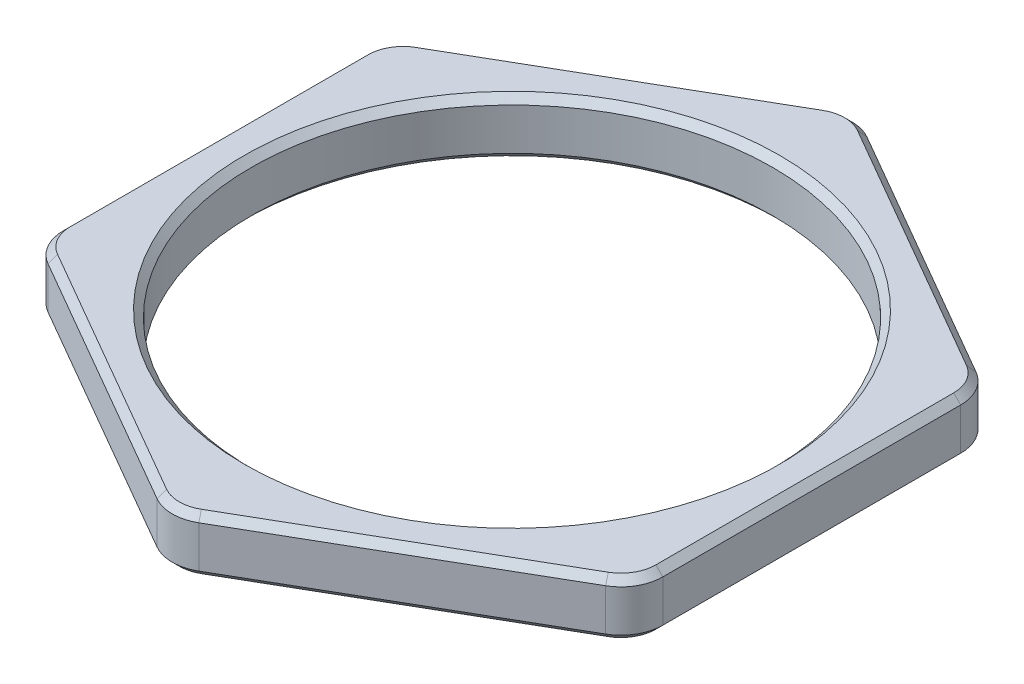
ISO-10303-21;
HEADER;
FILE_DESCRIPTION(('STEP AP214'),'2;1');
FILE_NAME('part.step','',(''),(''),'','','');
FILE_SCHEMA(('AUTOMOTIVE_DESIGN { 1 0 10303 214 1 1 1 1 }'));
ENDSEC;
DATA;
#1=APPLICATION_CONTEXT('core data for automotive mechanical design processes');
#2=APPLICATION_PROTOCOL_DEFINITION('international standard','automotive_design',2000,#1);
#3=PRODUCT_CONTEXT('',#1,'mechanical');
#4=PRODUCT('Part','Part','',(#3));
#5=PRODUCT_RELATED_PRODUCT_CATEGORY('part','',(#4));
#6=PRODUCT_DEFINITION_FORMATION('','',#4);
#7=PRODUCT_DEFINITION_CONTEXT('part definition',#1,'design');
#8=PRODUCT_DEFINITION('design','',#6,#7);
#9=PRODUCT_DEFINITION_SHAPE('','',#8);
#10=(LENGTH_UNIT() NAMED_UNIT(*) SI_UNIT(.MILLI.,.METRE.));
#11=(NAMED_UNIT(*) PLANE_ANGLE_UNIT() SI_UNIT($,.RADIAN.));
#12=(NAMED_UNIT(*) SI_UNIT($,.STERADIAN.) SOLID_ANGLE_UNIT());
#13=UNCERTAINTY_MEASURE_WITH_UNIT(LENGTH_MEASURE(1.E-05),#10,'distance_accuracy_value','');
#14=(GEOMETRIC_REPRESENTATION_CONTEXT(3) GLOBAL_UNCERTAINTY_ASSIGNED_CONTEXT((#13)) GLOBAL_UNIT_ASSIGNED_CONTEXT((#10,
#11,#12)) REPRESENTATION_CONTEXT('',''));
#15=CARTESIAN_POINT('',(0.,0.,0.));
#16=DIRECTION('',(0.,0.,1.));
#17=DIRECTION('',(1.,0.,0.));
#18=AXIS2_PLACEMENT_3D('',#15,#16,#17);
#19=CARTESIAN_POINT('',(0.,4.,-21.3619599600162));
#20=DIRECTION('',(0.,-1.,0.));
#21=DIRECTION('',(0.,0.,-1.));
#22=AXIS2_PLACEMENT_3D('',#19,#20,#21);
#23=PLANE('',#22);
#24=CARTESIAN_POINT('',(0.,4.,0.));
#25=DIRECTION('',(0.,-1.,0.));
#26=DIRECTION('',(0.,0.,-1.));
#27=AXIS2_PLACEMENT_3D('',#24,#25,#26);
#28=CIRCLE('',#27,19.1949509943483);
#29=CARTESIAN_POINT('',(0.,4.,-19.1949509943483));
#30=VERTEX_POINT('',#29);
#31=EDGE_CURVE('E11',#30,#30,#28,.T.);
#32=ORIENTED_EDGE('',*,*,#31,.T.);
#33=EDGE_LOOP('',(#32));
#34=FACE_BOUND('',#33,.T.);
#35=CARTESIAN_POINT('',(18.5,4.,-10.6809799800081));
#36=DIRECTION('',(0.,-1.,0.));
#37=DIRECTION('',(0.,0.,-1.));
#38=AXIS2_PLACEMENT_3D('',#35,#36,#37);
#39=CIRCLE('',#38,2.50000000000003);
#40=CARTESIAN_POINT('',(21.,4.,-10.6809799800081));
#41=VERTEX_POINT('',#40);
#42=CARTESIAN_POINT('',(19.75,4.,-12.8460434894692));
#43=VERTEX_POINT('',#42);
#44=EDGE_CURVE('E54',#41,#43,#39,.F.);
#45=ORIENTED_EDGE('',*,*,#44,.T.);
#46=DIRECTION('',(-0.866025403784438,0.,-0.5));
#47=VECTOR('',#46,1.);
#48=CARTESIAN_POINT('',(1.25000000000002,4.,-23.5270234694773));
#49=LINE('',#48,#47);
#50=CARTESIAN_POINT('',(1.25000000000002,4.,-23.5270234694773));
#51=VERTEX_POINT('',#50);
#52=EDGE_CURVE('E46',#43,#51,#49,.T.);
#53=ORIENTED_EDGE('',*,*,#52,.T.);
#54=CARTESIAN_POINT('',(0.,4.,-21.3619599600162));
#55=DIRECTION('',(0.,-1.,0.));
#56=DIRECTION('',(0.,0.,-1.));
#57=AXIS2_PLACEMENT_3D('',#54,#55,#56);
#58=CIRCLE('',#57,2.50000000000003);
#59=CARTESIAN_POINT('',(-1.25000000000001,4.,-23.5270234694773));
#60=VERTEX_POINT('',#59);
#61=EDGE_CURVE('E289',#51,#60,#58,.F.);
#62=ORIENTED_EDGE('',*,*,#61,.T.);
#63=DIRECTION('',(-0.866025403784439,0.,0.5));
#64=VECTOR('',#63,1.);
#65=CARTESIAN_POINT('',(-1.25000000000001,4.,-23.5270234694773));
#66=LINE('',#65,#64);
#67=CARTESIAN_POINT('',(-19.75,4.,-12.8460434894692));
#68=VERTEX_POINT('',#67);
#69=EDGE_CURVE('E291',#60,#68,#66,.T.);
#70=ORIENTED_EDGE('',*,*,#69,.T.);
#71=CARTESIAN_POINT('',(-18.5,4.,-10.6809799800081));
#72=DIRECTION('',(0.,-1.,0.));
#73=DIRECTION('',(0.,0.,-1.));
#74=AXIS2_PLACEMENT_3D('',#71,#72,#73);
#75=CIRCLE('',#74,2.50000000000003);
#76=CARTESIAN_POINT('',(-21.,4.,-10.6809799800081));
#77=VERTEX_POINT('',#76);
#78=EDGE_CURVE('E293',#68,#77,#75,.F.);
#79=ORIENTED_EDGE('',*,*,#78,.T.);
#80=DIRECTION('',(0.,0.,1.));
#81=VECTOR('',#80,1.);
#82=CARTESIAN_POINT('',(-21.,4.,-21.3619599600162));
#83=LINE('',#82,#81);
#84=CARTESIAN_POINT('',(-21.,4.,10.6809799800081));
#85=VERTEX_POINT('',#84);
#86=EDGE_CURVE('E295',#77,#85,#83,.T.);
#87=ORIENTED_EDGE('',*,*,#86,.T.);
#88=CARTESIAN_POINT('',(-18.5,4.,10.6809799800081));
#89=DIRECTION('',(0.,-1.,0.));
#90=DIRECTION('',(0.,0.,-1.));
#91=AXIS2_PLACEMENT_3D('',#88,#89,#90);
#92=CIRCLE('',#91,2.50000000000003);
#93=CARTESIAN_POINT('',(-19.75,4.,12.8460434894692));
#94=VERTEX_POINT('',#93);
#95=EDGE_CURVE('E297',#85,#94,#92,.F.);
#96=ORIENTED_EDGE('',*,*,#95,.T.);
#97=DIRECTION('',(0.866025403784439,0.,0.5));
#98=VECTOR('',#97,1.);
#99=CARTESIAN_POINT('',(-19.75,4.,12.8460434894692));
#100=LINE('',#99,#98);
#101=CARTESIAN_POINT('',(-1.25,4.,23.5270234694773));
#102=VERTEX_POINT('',#101);
#103=EDGE_CURVE('E299',#94,#102,#100,.T.);
#104=ORIENTED_EDGE('',*,*,#103,.T.);
#105=CARTESIAN_POINT('',(0.,4.,21.3619599600162));
#106=DIRECTION('',(0.,-1.,0.));
#107=DIRECTION('',(0.,0.,-1.));
#108=AXIS2_PLACEMENT_3D('',#105,#106,#107);
#109=CIRCLE('',#108,2.50000000000003);
#110=CARTESIAN_POINT('',(1.25000000000002,4.,23.5270234694773));
#111=VERTEX_POINT('',#110);
#112=EDGE_CURVE('E301',#102,#111,#109,.F.);
#113=ORIENTED_EDGE('',*,*,#112,.T.);
#114=DIRECTION('',(0.866025403784439,0.,-0.5));
#115=VECTOR('',#114,1.);
#116=CARTESIAN_POINT('',(19.75,4.,12.8460434894692));
#117=LINE('',#116,#115);
#118=CARTESIAN_POINT('',(19.75,4.,12.8460434894692));
#119=VERTEX_POINT('',#118);
#120=EDGE_CURVE('E303',#111,#119,#117,.T.);
#121=ORIENTED_EDGE('',*,*,#120,.T.);
#122=CARTESIAN_POINT('',(18.5,4.,10.6809799800081));
#123=DIRECTION('',(0.,-1.,0.));
#124=DIRECTION('',(0.,0.,-1.));
#125=AXIS2_PLACEMENT_3D('',#122,#123,#124);
#126=CIRCLE('',#125,2.50000000000003);
#127=CARTESIAN_POINT('',(21.,4.,10.6809799800081));
#128=VERTEX_POINT('',#127);
#129=EDGE_CURVE('E305',#119,#128,#126,.F.);
#130=ORIENTED_EDGE('',*,*,#129,.T.);
#131=DIRECTION('',(0.,0.,-1.));
#132=VECTOR('',#131,1.);
#133=CARTESIAN_POINT('',(21.,4.,-21.3619599600162));
#134=LINE('',#133,#132);
#135=EDGE_CURVE('E59',#128,#41,#134,.T.);
#136=ORIENTED_EDGE('',*,*,#135,.T.);
#137=EDGE_LOOP('',(#45,#53,#62,#70,#79,#87,#96,#104,#113,#121,#130,#136));
#138=FACE_BOUND('',#137,.T.);
#139=ADVANCED_FACE('F37',(#34,#138),#23,.F.);
#140=CARTESIAN_POINT('',(0.,0.,-21.3619599600162));
#141=DIRECTION('',(0.,-1.,0.));
#142=DIRECTION('',(0.,0.,-1.));
#143=AXIS2_PLACEMENT_3D('',#140,#141,#142);
#144=PLANE('',#143);
#145=CARTESIAN_POINT('',(0.,0.,0.));
#146=DIRECTION('',(0.,-1.,0.));
#147=DIRECTION('',(0.,0.,-1.));
#148=AXIS2_PLACEMENT_3D('',#145,#146,#147);
#149=CIRCLE('',#148,19.1949509943483);
#150=CARTESIAN_POINT('',(0.,0.,-19.1949509943483));
#151=VERTEX_POINT('',#150);
#152=EDGE_CURVE('E227',#151,#151,#149,.F.);
#153=ORIENTED_EDGE('',*,*,#152,.T.);
#154=EDGE_LOOP('',(#153));
#155=FACE_BOUND('',#154,.T.);
#156=CARTESIAN_POINT('',(-18.5,0.,-10.6809799800081));
#157=DIRECTION('',(0.,-1.,0.));
#158=DIRECTION('',(0.,0.,-1.));
#159=AXIS2_PLACEMENT_3D('',#156,#157,#158);
#160=CIRCLE('',#159,2.5);
#161=CARTESIAN_POINT('',(-21.,0.,-10.6809799800081));
#162=VERTEX_POINT('',#161);
#163=CARTESIAN_POINT('',(-19.75,0.,-12.8460434894692));
#164=VERTEX_POINT('',#163);
#165=EDGE_CURVE('E226',#162,#164,#160,.T.);
#166=ORIENTED_EDGE('',*,*,#165,.T.);
#167=DIRECTION('',(0.866025403784439,0.,-0.5));
#168=VECTOR('',#167,1.);
#169=CARTESIAN_POINT('',(-1.25,0.,-23.5270234694773));
#170=LINE('',#169,#168);
#171=CARTESIAN_POINT('',(-1.25,0.,-23.5270234694773));
#172=VERTEX_POINT('',#171);
#173=EDGE_CURVE('E205',#164,#172,#170,.T.);
#174=ORIENTED_EDGE('',*,*,#173,.T.);
#175=CARTESIAN_POINT('',(0.,0.,-21.3619599600162));
#176=DIRECTION('',(0.,-1.,0.));
#177=DIRECTION('',(0.,0.,-1.));
#178=AXIS2_PLACEMENT_3D('',#175,#176,#177);
#179=CIRCLE('',#178,2.5);
#180=CARTESIAN_POINT('',(1.25000000000001,0.,-23.5270234694773));
#181=VERTEX_POINT('',#180);
#182=EDGE_CURVE('E215',#172,#181,#179,.T.);
#183=ORIENTED_EDGE('',*,*,#182,.T.);
#184=DIRECTION('',(0.866025403784438,0.,0.5));
#185=VECTOR('',#184,1.);
#186=CARTESIAN_POINT('',(19.75,0.,-12.8460434894692));
#187=LINE('',#186,#185);
#188=CARTESIAN_POINT('',(19.75,0.,-12.8460434894692));
#189=VERTEX_POINT('',#188);
#190=EDGE_CURVE('E221',#181,#189,#187,.T.);
#191=ORIENTED_EDGE('',*,*,#190,.T.);
#192=CARTESIAN_POINT('',(18.5,0.,-10.6809799800081));
#193=DIRECTION('',(0.,-1.,0.));
#194=DIRECTION('',(0.,0.,-1.));
#195=AXIS2_PLACEMENT_3D('',#192,#193,#194);
#196=CIRCLE('',#195,2.5);
#197=CARTESIAN_POINT('',(21.,0.,-10.6809799800081));
#198=VERTEX_POINT('',#197);
#199=EDGE_CURVE('E412',#189,#198,#196,.T.);
#200=ORIENTED_EDGE('',*,*,#199,.T.);
#201=DIRECTION('',(0.,0.,1.));
#202=VECTOR('',#201,1.);
#203=CARTESIAN_POINT('',(21.,0.,10.6809799800081));
#204=LINE('',#203,#202);
#205=CARTESIAN_POINT('',(21.,0.,10.6809799800081));
#206=VERTEX_POINT('',#205);
#207=EDGE_CURVE('E414',#198,#206,#204,.T.);
#208=ORIENTED_EDGE('',*,*,#207,.T.);
#209=CARTESIAN_POINT('',(18.5,0.,10.6809799800081));
#210=DIRECTION('',(0.,-1.,0.));
#211=DIRECTION('',(0.,0.,-1.));
#212=AXIS2_PLACEMENT_3D('',#209,#210,#211);
#213=CIRCLE('',#212,2.5);
#214=CARTESIAN_POINT('',(19.75,0.,12.8460434894692));
#215=VERTEX_POINT('',#214);
#216=EDGE_CURVE('E416',#206,#215,#213,.T.);
#217=ORIENTED_EDGE('',*,*,#216,.T.);
#218=DIRECTION('',(-0.866025403784439,0.,0.5));
#219=VECTOR('',#218,1.);
#220=CARTESIAN_POINT('',(1.25000000000001,0.,23.5270234694772));
#221=LINE('',#220,#219);
#222=CARTESIAN_POINT('',(1.25000000000001,0.,23.5270234694772));
#223=VERTEX_POINT('',#222);
#224=EDGE_CURVE('E418',#215,#223,#221,.T.);
#225=ORIENTED_EDGE('',*,*,#224,.T.);
#226=CARTESIAN_POINT('',(0.,0.,21.3619599600162));
#227=DIRECTION('',(0.,-1.,0.));
#228=DIRECTION('',(0.,0.,-1.));
#229=AXIS2_PLACEMENT_3D('',#226,#227,#228);
#230=CIRCLE('',#229,2.5);
#231=CARTESIAN_POINT('',(-1.24999999999999,0.,23.5270234694772));
#232=VERTEX_POINT('',#231);
#233=EDGE_CURVE('E420',#223,#232,#230,.T.);
#234=ORIENTED_EDGE('',*,*,#233,.T.);
#235=DIRECTION('',(-0.866025403784439,0.,-0.5));
#236=VECTOR('',#235,1.);
#237=CARTESIAN_POINT('',(-19.75,0.,12.8460434894692));
#238=LINE('',#237,#236);
#239=CARTESIAN_POINT('',(-19.75,0.,12.8460434894692));
#240=VERTEX_POINT('',#239);
#241=EDGE_CURVE('E422',#232,#240,#238,.T.);
#242=ORIENTED_EDGE('',*,*,#241,.T.);
#243=CARTESIAN_POINT('',(-18.5,0.,10.6809799800081));
#244=DIRECTION('',(0.,-1.,0.));
#245=DIRECTION('',(0.,0.,-1.));
#246=AXIS2_PLACEMENT_3D('',#243,#244,#245);
#247=CIRCLE('',#246,2.5);
#248=CARTESIAN_POINT('',(-21.,0.,10.6809799800081));
#249=VERTEX_POINT('',#248);
#250=EDGE_CURVE('E424',#240,#249,#247,.T.);
#251=ORIENTED_EDGE('',*,*,#250,.T.);
#252=DIRECTION('',(0.,0.,-1.));
#253=VECTOR('',#252,1.);
#254=CARTESIAN_POINT('',(-21.,0.,-10.6809799800081));
#255=LINE('',#254,#253);
#256=EDGE_CURVE('E232',#249,#162,#255,.T.);
#257=ORIENTED_EDGE('',*,*,#256,.T.);
#258=EDGE_LOOP('',(#166,#174,#183,#191,#200,#208,#217,#225,#234,#242,#251,#257));
#259=FACE_BOUND('',#258,.T.);
#260=ADVANCED_FACE('F224',(#155,#259),#144,.T.);
#261=CARTESIAN_POINT('',(0.,4.,-21.3619599600162));
#262=DIRECTION('',(0.,-1.,0.));
#263=DIRECTION('',(0.,0.,-1.));
#264=AXIS2_PLACEMENT_3D('',#261,#262,#263);
#265=CYLINDRICAL_SURFACE('',#264,3.);
#266=DIRECTION('',(0.,-1.,0.));
#267=VECTOR('',#266,1.);
#268=CARTESIAN_POINT('',(1.50000000000001,4.,-23.9600361713695));
#269=LINE('',#268,#267);
#270=CARTESIAN_POINT('',(1.50000000000001,3.50000000000002,-23.9600361713695));
#271=VERTEX_POINT('',#270);
#272=CARTESIAN_POINT('',(1.50000000000001,0.499999999999998,-23.9600361713695));
#273=VERTEX_POINT('',#272);
#274=EDGE_CURVE('E338',#271,#273,#269,.T.);
#275=ORIENTED_EDGE('',*,*,#274,.T.);
#276=CARTESIAN_POINT('',(0.,0.499999999999998,-21.3619599600162));
#277=DIRECTION('',(0.,-1.,0.));
#278=DIRECTION('',(0.,0.,-1.));
#279=AXIS2_PLACEMENT_3D('',#276,#277,#278);
#280=CIRCLE('',#279,3.);
#281=CARTESIAN_POINT('',(-1.5,0.499999999999998,-23.9600361713695));
#282=VERTEX_POINT('',#281);
#283=EDGE_CURVE('E287',#273,#282,#280,.F.);
#284=ORIENTED_EDGE('',*,*,#283,.T.);
#285=DIRECTION('',(0.,-1.,0.));
#286=VECTOR('',#285,1.);
#287=CARTESIAN_POINT('',(-1.5,4.,-23.9600361713695));
#288=LINE('',#287,#286);
#289=CARTESIAN_POINT('',(-1.5,3.50000000000002,-23.9600361713695));
#290=VERTEX_POINT('',#289);
#291=EDGE_CURVE('E222',#290,#282,#288,.T.);
#292=ORIENTED_EDGE('',*,*,#291,.F.);
#293=CARTESIAN_POINT('',(0.,3.50000000000002,-21.3619599600162));
#294=DIRECTION('',(0.,-1.,0.));
#295=DIRECTION('',(0.,0.,-1.));
#296=AXIS2_PLACEMENT_3D('',#293,#294,#295);
#297=CIRCLE('',#296,3.);
#298=EDGE_CURVE('E285',#290,#271,#297,.T.);
#299=ORIENTED_EDGE('',*,*,#298,.T.);
#300=EDGE_LOOP('',(#275,#284,#292,#299));
#301=FACE_BOUND('',#300,.T.);
#302=ADVANCED_FACE('F456',(#301),#265,.T.);
#303=CARTESIAN_POINT('',(-1.5,4.,-23.9600361713695));
#304=DIRECTION('',(0.5,0.,0.866025403784439));
#305=DIRECTION('',(0.866025403784439,0.,-0.5));
#306=AXIS2_PLACEMENT_3D('',#303,#304,#305);
#307=PLANE('',#306);
#308=ORIENTED_EDGE('',*,*,#291,.T.);
#309=DIRECTION('',(-0.866025403784439,0.,0.5));
#310=VECTOR('',#309,1.);
#311=CARTESIAN_POINT('',(-20.,0.5,-13.2790561913614));
#312=LINE('',#311,#310);
#313=CARTESIAN_POINT('',(-20.,0.499999999999998,-13.2790561913614));
#314=VERTEX_POINT('',#313);
#315=EDGE_CURVE('E208',#282,#314,#312,.T.);
#316=ORIENTED_EDGE('',*,*,#315,.T.);
#317=DIRECTION('',(0.,-1.,0.));
#318=VECTOR('',#317,1.);
#319=CARTESIAN_POINT('',(-20.,4.,-13.2790561913614));
#320=LINE('',#319,#318);
#321=CARTESIAN_POINT('',(-20.,3.50000000000002,-13.2790561913614));
#322=VERTEX_POINT('',#321);
#323=EDGE_CURVE('E406',#322,#314,#320,.T.);
#324=ORIENTED_EDGE('',*,*,#323,.F.);
#325=DIRECTION('',(0.866025403784439,0.,-0.5));
#326=VECTOR('',#325,1.);
#327=CARTESIAN_POINT('',(-1.5,3.50000000000002,-23.9600361713695));
#328=LINE('',#327,#326);
#329=EDGE_CURVE('E241',#322,#290,#328,.T.);
#330=ORIENTED_EDGE('',*,*,#329,.T.);
#331=EDGE_LOOP('',(#308,#316,#324,#330));
#332=FACE_BOUND('',#331,.T.);
#333=ADVANCED_FACE('F439',(#332),#307,.F.);
#334=CARTESIAN_POINT('',(-18.5,4.,-10.6809799800081));
#335=DIRECTION('',(0.,-1.,0.));
#336=DIRECTION('',(0.,0.,-1.));
#337=AXIS2_PLACEMENT_3D('',#334,#335,#336);
#338=CYLINDRICAL_SURFACE('',#337,3.00000000000001);
#339=ORIENTED_EDGE('',*,*,#323,.T.);
#340=CARTESIAN_POINT('',(-18.5,0.499999999999998,-10.6809799800081));
#341=DIRECTION('',(0.,-1.,0.));
#342=DIRECTION('',(0.,0.,-1.));
#343=AXIS2_PLACEMENT_3D('',#340,#341,#342);
#344=CIRCLE('',#343,3.00000000000001);
#345=CARTESIAN_POINT('',(-21.5,0.499999999999998,-10.6809799800081));
#346=VERTEX_POINT('',#345);
#347=EDGE_CURVE('E246',#314,#346,#344,.F.);
#348=ORIENTED_EDGE('',*,*,#347,.T.);
#349=DIRECTION('',(0.,-1.,0.));
#350=VECTOR('',#349,1.);
#351=CARTESIAN_POINT('',(-21.5,4.,-10.6809799800081));
#352=LINE('',#351,#350);
#353=CARTESIAN_POINT('',(-21.5,3.50000000000002,-10.6809799800081));
#354=VERTEX_POINT('',#353);
#355=EDGE_CURVE('E398',#354,#346,#352,.T.);
#356=ORIENTED_EDGE('',*,*,#355,.F.);
#357=CARTESIAN_POINT('',(-18.5,3.50000000000002,-10.6809799800081));
#358=DIRECTION('',(0.,-1.,0.));
#359=DIRECTION('',(0.,0.,-1.));
#360=AXIS2_PLACEMENT_3D('',#357,#358,#359);
#361=CIRCLE('',#360,3.00000000000001);
#362=EDGE_CURVE('E244',#354,#322,#361,.T.);
#363=ORIENTED_EDGE('',*,*,#362,.T.);
#364=EDGE_LOOP('',(#339,#348,#356,#363));
#365=FACE_BOUND('',#364,.T.);
#366=ADVANCED_FACE('F442',(#365),#338,.T.);
#367=CARTESIAN_POINT('',(-21.5,4.,-10.6809799800081));
#368=DIRECTION('',(1.,0.,0.));
#369=DIRECTION('',(0.,0.,-1.));
#370=AXIS2_PLACEMENT_3D('',#367,#368,#369);
#371=PLANE('',#370);
#372=ORIENTED_EDGE('',*,*,#355,.T.);
#373=DIRECTION('',(0.,0.,1.));
#374=VECTOR('',#373,1.);
#375=CARTESIAN_POINT('',(-21.5,0.499999999999998,10.6809799800081));
#376=LINE('',#375,#374);
#377=CARTESIAN_POINT('',(-21.5,0.499999999999998,10.6809799800081));
#378=VERTEX_POINT('',#377);
#379=EDGE_CURVE('E250',#346,#378,#376,.T.);
#380=ORIENTED_EDGE('',*,*,#379,.T.);
#381=DIRECTION('',(0.,-1.,0.));
#382=VECTOR('',#381,1.);
#383=CARTESIAN_POINT('',(-21.5,4.,10.6809799800081));
#384=LINE('',#383,#382);
#385=CARTESIAN_POINT('',(-21.5,3.50000000000002,10.6809799800081));
#386=VERTEX_POINT('',#385);
#387=EDGE_CURVE('E396',#386,#378,#384,.T.);
#388=ORIENTED_EDGE('',*,*,#387,.F.);
#389=DIRECTION('',(0.,0.,-1.));
#390=VECTOR('',#389,1.);
#391=CARTESIAN_POINT('',(-21.5,3.50000000000002,-10.6809799800081));
#392=LINE('',#391,#390);
#393=EDGE_CURVE('E248',#386,#354,#392,.T.);
#394=ORIENTED_EDGE('',*,*,#393,.T.);
#395=EDGE_LOOP('',(#372,#380,#388,#394));
#396=FACE_BOUND('',#395,.T.);
#397=ADVANCED_FACE('F543',(#396),#371,.F.);
#398=CARTESIAN_POINT('',(-18.5,4.,10.6809799800081));
#399=DIRECTION('',(0.,-1.,0.));
#400=DIRECTION('',(0.,0.,-1.));
#401=AXIS2_PLACEMENT_3D('',#398,#399,#400);
#402=CYLINDRICAL_SURFACE('',#401,3.);
#403=ORIENTED_EDGE('',*,*,#387,.T.);
#404=CARTESIAN_POINT('',(-18.5,0.499999999999998,10.6809799800081));
#405=DIRECTION('',(0.,-1.,0.));
#406=DIRECTION('',(0.,0.,-1.));
#407=AXIS2_PLACEMENT_3D('',#404,#405,#406);
#408=CIRCLE('',#407,3.);
#409=CARTESIAN_POINT('',(-20.,0.499999999999999,13.2790561913614));
#410=VERTEX_POINT('',#409);
#411=EDGE_CURVE('E254',#378,#410,#408,.F.);
#412=ORIENTED_EDGE('',*,*,#411,.T.);
#413=DIRECTION('',(0.,-1.,0.));
#414=VECTOR('',#413,1.);
#415=CARTESIAN_POINT('',(-20.,4.,13.2790561913614));
#416=LINE('',#415,#414);
#417=CARTESIAN_POINT('',(-20.,3.50000000000002,13.2790561913614));
#418=VERTEX_POINT('',#417);
#419=EDGE_CURVE('E387',#418,#410,#416,.T.);
#420=ORIENTED_EDGE('',*,*,#419,.F.);
#421=CARTESIAN_POINT('',(-18.5,3.50000000000002,10.6809799800081));
#422=DIRECTION('',(0.,-1.,0.));
#423=DIRECTION('',(0.,0.,-1.));
#424=AXIS2_PLACEMENT_3D('',#421,#422,#423);
#425=CIRCLE('',#424,3.);
#426=EDGE_CURVE('E252',#418,#386,#425,.T.);
#427=ORIENTED_EDGE('',*,*,#426,.T.);
#428=EDGE_LOOP('',(#403,#412,#420,#427));
#429=FACE_BOUND('',#428,.T.);
#430=ADVANCED_FACE('F393',(#429),#402,.T.);
#431=CARTESIAN_POINT('',(-20.,4.,13.2790561913614));
#432=DIRECTION('',(0.5,0.,-0.866025403784439));
#433=DIRECTION('',(-0.866025403784439,0.,-0.5));
#434=AXIS2_PLACEMENT_3D('',#431,#432,#433);
#435=PLANE('',#434);
#436=ORIENTED_EDGE('',*,*,#419,.T.);
#437=DIRECTION('',(0.866025403784439,0.,0.5));
#438=VECTOR('',#437,1.);
#439=CARTESIAN_POINT('',(-1.49999999999999,0.499999999999999,23.9600361713695));
#440=LINE('',#439,#438);
#441=CARTESIAN_POINT('',(-1.49999999999999,0.499999999999998,23.9600361713695));
#442=VERTEX_POINT('',#441);
#443=EDGE_CURVE('E258',#410,#442,#440,.T.);
#444=ORIENTED_EDGE('',*,*,#443,.T.);
#445=DIRECTION('',(0.,-1.,0.));
#446=VECTOR('',#445,1.);
#447=CARTESIAN_POINT('',(-1.49999999999999,4.,23.9600361713695));
#448=LINE('',#447,#446);
#449=CARTESIAN_POINT('',(-1.49999999999999,3.50000000000002,23.9600361713695));
#450=VERTEX_POINT('',#449);
#451=EDGE_CURVE('E390',#450,#442,#448,.T.);
#452=ORIENTED_EDGE('',*,*,#451,.F.);
#453=DIRECTION('',(-0.866025403784439,0.,-0.5));
#454=VECTOR('',#453,1.);
#455=CARTESIAN_POINT('',(-20.,3.50000000000002,13.2790561913614));
#456=LINE('',#455,#454);
#457=EDGE_CURVE('E256',#450,#418,#456,.T.);
#458=ORIENTED_EDGE('',*,*,#457,.T.);
#459=EDGE_LOOP('',(#436,#444,#452,#458));
#460=FACE_BOUND('',#459,.T.);
#461=ADVANCED_FACE('F386',(#460),#435,.F.);
#462=CARTESIAN_POINT('',(0.,4.,21.3619599600162));
#463=DIRECTION('',(0.,-1.,0.));
#464=DIRECTION('',(0.,0.,-1.));
#465=AXIS2_PLACEMENT_3D('',#462,#463,#464);
#466=CYLINDRICAL_SURFACE('',#465,3.);
#467=ORIENTED_EDGE('',*,*,#451,.T.);
#468=CARTESIAN_POINT('',(0.,0.499999999999998,21.3619599600162));
#469=DIRECTION('',(0.,-1.,0.));
#470=DIRECTION('',(0.,0.,-1.));
#471=AXIS2_PLACEMENT_3D('',#468,#469,#470);
#472=CIRCLE('',#471,3.);
#473=CARTESIAN_POINT('',(1.50000000000001,0.499999999999999,23.9600361713695));
#474=VERTEX_POINT('',#473);
#475=EDGE_CURVE('E262',#442,#474,#472,.F.);
#476=ORIENTED_EDGE('',*,*,#475,.T.);
#477=DIRECTION('',(0.,-1.,0.));
#478=VECTOR('',#477,1.);
#479=CARTESIAN_POINT('',(1.50000000000001,4.,23.9600361713695));
#480=LINE('',#479,#478);
#481=CARTESIAN_POINT('',(1.50000000000001,3.50000000000002,23.9600361713695));
#482=VERTEX_POINT('',#481);
#483=EDGE_CURVE('E400',#482,#474,#480,.T.);
#484=ORIENTED_EDGE('',*,*,#483,.F.);
#485=CARTESIAN_POINT('',(0.,3.50000000000002,21.3619599600162));
#486=DIRECTION('',(0.,-1.,0.));
#487=DIRECTION('',(0.,0.,-1.));
#488=AXIS2_PLACEMENT_3D('',#485,#486,#487);
#489=CIRCLE('',#488,3.);
#490=EDGE_CURVE('E260',#482,#450,#489,.T.);
#491=ORIENTED_EDGE('',*,*,#490,.T.);
#492=EDGE_LOOP('',(#467,#476,#484,#491));
#493=FACE_BOUND('',#492,.T.);
#494=ADVANCED_FACE('F534',(#493),#466,.T.);
#495=CARTESIAN_POINT('',(1.50000000000001,4.,23.9600361713695));
#496=DIRECTION('',(-0.5,0.,-0.866025403784439));
#497=DIRECTION('',(-0.866025403784439,0.,0.5));
#498=AXIS2_PLACEMENT_3D('',#495,#496,#497);
#499=PLANE('',#498);
#500=ORIENTED_EDGE('',*,*,#483,.T.);
#501=DIRECTION('',(0.866025403784439,0.,-0.5));
#502=VECTOR('',#501,1.);
#503=CARTESIAN_POINT('',(20.,0.499999999999999,13.2790561913614));
#504=LINE('',#503,#502);
#505=CARTESIAN_POINT('',(20.,0.499999999999998,13.2790561913614));
#506=VERTEX_POINT('',#505);
#507=EDGE_CURVE('E266',#474,#506,#504,.T.);
#508=ORIENTED_EDGE('',*,*,#507,.T.);
#509=DIRECTION('',(0.,-1.,0.));
#510=VECTOR('',#509,1.);
#511=CARTESIAN_POINT('',(20.,4.,13.2790561913614));
#512=LINE('',#511,#510);
#513=CARTESIAN_POINT('',(20.,3.50000000000002,13.2790561913614));
#514=VERTEX_POINT('',#513);
#515=EDGE_CURVE('E879',#514,#506,#512,.T.);
#516=ORIENTED_EDGE('',*,*,#515,.F.);
#517=DIRECTION('',(-0.866025403784439,0.,0.5));
#518=VECTOR('',#517,1.);
#519=CARTESIAN_POINT('',(1.50000000000001,3.50000000000002,23.9600361713695));
#520=LINE('',#519,#518);
#521=EDGE_CURVE('E264',#514,#482,#520,.T.);
#522=ORIENTED_EDGE('',*,*,#521,.T.);
#523=EDGE_LOOP('',(#500,#508,#516,#522));
#524=FACE_BOUND('',#523,.T.);
#525=ADVANCED_FACE('F530',(#524),#499,.F.);
#526=CARTESIAN_POINT('',(18.5,4.,10.6809799800081));
#527=DIRECTION('',(0.,-1.,0.));
#528=DIRECTION('',(0.,0.,-1.));
#529=AXIS2_PLACEMENT_3D('',#526,#527,#528);
#530=CYLINDRICAL_SURFACE('',#529,3.);
#531=ORIENTED_EDGE('',*,*,#515,.T.);
#532=CARTESIAN_POINT('',(18.5,0.499999999999998,10.6809799800081));
#533=DIRECTION('',(0.,-1.,0.));
#534=DIRECTION('',(0.,0.,-1.));
#535=AXIS2_PLACEMENT_3D('',#532,#533,#534);
#536=CIRCLE('',#535,3.);
#537=CARTESIAN_POINT('',(21.5,0.499999999999998,10.6809799800081));
#538=VERTEX_POINT('',#537);
#539=EDGE_CURVE('E270',#506,#538,#536,.F.);
#540=ORIENTED_EDGE('',*,*,#539,.T.);
#541=DIRECTION('',(0.,-1.,0.));
#542=VECTOR('',#541,1.);
#543=CARTESIAN_POINT('',(21.5,4.,10.6809799800081));
#544=LINE('',#543,#542);
#545=CARTESIAN_POINT('',(21.5,3.50000000000002,10.6809799800081));
#546=VERTEX_POINT('',#545);
#547=EDGE_CURVE('E874',#546,#538,#544,.T.);
#548=ORIENTED_EDGE('',*,*,#547,.F.);
#549=CARTESIAN_POINT('',(18.5,3.50000000000002,10.6809799800081));
#550=DIRECTION('',(0.,-1.,0.));
#551=DIRECTION('',(0.,0.,-1.));
#552=AXIS2_PLACEMENT_3D('',#549,#550,#551);
#553=CIRCLE('',#552,3.);
#554=EDGE_CURVE('E268',#546,#514,#553,.T.);
#555=ORIENTED_EDGE('',*,*,#554,.T.);
#556=EDGE_LOOP('',(#531,#540,#548,#555));
#557=FACE_BOUND('',#556,.T.);
#558=ADVANCED_FACE('F526',(#557),#530,.T.);
#559=CARTESIAN_POINT('',(21.5,4.,10.6809799800081));
#560=DIRECTION('',(-1.,0.,0.));
#561=DIRECTION('',(0.,0.,1.));
#562=AXIS2_PLACEMENT_3D('',#559,#560,#561);
#563=PLANE('',#562);
#564=ORIENTED_EDGE('',*,*,#547,.T.);
#565=DIRECTION('',(0.,0.,-1.));
#566=VECTOR('',#565,1.);
#567=CARTESIAN_POINT('',(21.5,0.499999999999998,-10.6809799800081));
#568=LINE('',#567,#566);
#569=CARTESIAN_POINT('',(21.5,0.499999999999998,-10.6809799800081));
#570=VERTEX_POINT('',#569);
#571=EDGE_CURVE('E274',#538,#570,#568,.T.);
#572=ORIENTED_EDGE('',*,*,#571,.T.);
#573=DIRECTION('',(0.,-1.,0.));
#574=VECTOR('',#573,1.);
#575=CARTESIAN_POINT('',(21.5,4.,-10.6809799800081));
#576=LINE('',#575,#574);
#577=CARTESIAN_POINT('',(21.5,3.50000000000002,-10.6809799800081));
#578=VERTEX_POINT('',#577);
#579=EDGE_CURVE('E872',#578,#570,#576,.T.);
#580=ORIENTED_EDGE('',*,*,#579,.F.);
#581=DIRECTION('',(0.,0.,1.));
#582=VECTOR('',#581,1.);
#583=CARTESIAN_POINT('',(21.5,3.50000000000002,10.6809799800081));
#584=LINE('',#583,#582);
#585=EDGE_CURVE('E272',#578,#546,#584,.T.);
#586=ORIENTED_EDGE('',*,*,#585,.T.);
#587=EDGE_LOOP('',(#564,#572,#580,#586));
#588=FACE_BOUND('',#587,.T.);
#589=ADVANCED_FACE('F522',(#588),#563,.F.);
#590=CARTESIAN_POINT('',(18.5,4.,-10.6809799800081));
#591=DIRECTION('',(0.,-1.,0.));
#592=DIRECTION('',(0.,0.,-1.));
#593=AXIS2_PLACEMENT_3D('',#590,#591,#592);
#594=CYLINDRICAL_SURFACE('',#593,3.);
#595=ORIENTED_EDGE('',*,*,#579,.T.);
#596=CARTESIAN_POINT('',(18.5,0.499999999999998,-10.6809799800081));
#597=DIRECTION('',(0.,-1.,0.));
#598=DIRECTION('',(0.,0.,-1.));
#599=AXIS2_PLACEMENT_3D('',#596,#597,#598);
#600=CIRCLE('',#599,3.);
#601=CARTESIAN_POINT('',(20.,0.499999999999997,-13.2790561913614));
#602=VERTEX_POINT('',#601);
#603=EDGE_CURVE('E278',#570,#602,#600,.F.);
#604=ORIENTED_EDGE('',*,*,#603,.T.);
#605=DIRECTION('',(0.,-1.,0.));
#606=VECTOR('',#605,1.);
#607=CARTESIAN_POINT('',(20.,4.,-13.2790561913614));
#608=LINE('',#607,#606);
#609=CARTESIAN_POINT('',(20.,3.50000000000002,-13.2790561913614));
#610=VERTEX_POINT('',#609);
#611=EDGE_CURVE('E460',#610,#602,#608,.T.);
#612=ORIENTED_EDGE('',*,*,#611,.F.);
#613=CARTESIAN_POINT('',(18.5,3.50000000000002,-10.6809799800081));
#614=DIRECTION('',(0.,-1.,0.));
#615=DIRECTION('',(0.,0.,-1.));
#616=AXIS2_PLACEMENT_3D('',#613,#614,#615);
#617=CIRCLE('',#616,3.);
#618=EDGE_CURVE('E276',#610,#578,#617,.T.);
#619=ORIENTED_EDGE('',*,*,#618,.T.);
#620=EDGE_LOOP('',(#595,#604,#612,#619));
#621=FACE_BOUND('',#620,.T.);
#622=ADVANCED_FACE('F519',(#621),#594,.T.);
#623=CARTESIAN_POINT('',(20.,4.,-13.2790561913614));
#624=DIRECTION('',(-0.5,0.,0.866025403784438));
#625=DIRECTION('',(0.866025403784438,0.,0.5));
#626=AXIS2_PLACEMENT_3D('',#623,#624,#625);
#627=PLANE('',#626);
#628=ORIENTED_EDGE('',*,*,#611,.T.);
#629=DIRECTION('',(-0.866025403784438,0.,-0.5));
#630=VECTOR('',#629,1.);
#631=CARTESIAN_POINT('',(1.50000000000001,0.499999999999997,-23.9600361713695));
#632=LINE('',#631,#630);
#633=EDGE_CURVE('E283',#602,#273,#632,.T.);
#634=ORIENTED_EDGE('',*,*,#633,.T.);
#635=ORIENTED_EDGE('',*,*,#274,.F.);
#636=DIRECTION('',(0.866025403784438,0.,0.5));
#637=VECTOR('',#636,1.);
#638=CARTESIAN_POINT('',(20.,3.50000000000002,-13.2790561913614));
#639=LINE('',#638,#637);
#640=EDGE_CURVE('E280',#271,#610,#639,.T.);
#641=ORIENTED_EDGE('',*,*,#640,.T.);
#642=EDGE_LOOP('',(#628,#634,#635,#641));
#643=FACE_BOUND('',#642,.T.);
#644=ADVANCED_FACE('F516',(#643),#627,.F.);
#645=CARTESIAN_POINT('',(0.,4.,0.));
#646=DIRECTION('',(0.,-1.,0.));
#647=DIRECTION('',(0.,0.,-1.));
#648=AXIS2_PLACEMENT_3D('',#645,#646,#647);
#649=CYLINDRICAL_SURFACE('',#648,18.6949509943483);
#650=CARTESIAN_POINT('',(0.,0.500000000000004,0.));
#651=DIRECTION('',(0.,-1.,0.));
#652=DIRECTION('',(0.,0.,-1.));
#653=AXIS2_PLACEMENT_3D('',#650,#651,#652);
#654=CIRCLE('',#653,18.6949509943483);
#655=CARTESIAN_POINT('',(0.,0.500000000000004,-18.6949509943483));
#656=VERTEX_POINT('',#655);
#657=EDGE_CURVE('E238',#656,#656,#654,.T.);
#658=ORIENTED_EDGE('',*,*,#657,.T.);
#659=EDGE_LOOP('',(#658));
#660=FACE_BOUND('',#659,.T.);
#661=CARTESIAN_POINT('',(0.,3.50000000000001,0.));
#662=DIRECTION('',(0.,-1.,0.));
#663=DIRECTION('',(0.,0.,-1.));
#664=AXIS2_PLACEMENT_3D('',#661,#662,#663);
#665=CIRCLE('',#664,18.6949509943483);
#666=CARTESIAN_POINT('',(0.,3.50000000000001,-18.6949509943483));
#667=VERTEX_POINT('',#666);
#668=EDGE_CURVE('E230',#667,#667,#665,.F.);
#669=ORIENTED_EDGE('',*,*,#668,.T.);
#670=EDGE_LOOP('',(#669));
#671=FACE_BOUND('',#670,.T.);
#672=ADVANCED_FACE('F514',(#660,#671),#649,.F.);
#673=CARTESIAN_POINT('',(0.,0.,0.));
#674=DIRECTION('',(0.,-1.,0.));
#675=DIRECTION('',(0.,0.,-1.));
#676=AXIS2_PLACEMENT_3D('',#673,#674,#675);
#677=CONICAL_SURFACE('',#676,19.1949509943483,0.785398163397448);
#678=ORIENTED_EDGE('',*,*,#657,.F.);
#679=EDGE_LOOP('',(#678));
#680=FACE_BOUND('',#679,.T.);
#681=ORIENTED_EDGE('',*,*,#152,.F.);
#682=EDGE_LOOP('',(#681));
#683=FACE_BOUND('',#682,.T.);
#684=ADVANCED_FACE('F553',(#680,#683),#677,.F.);
#685=CARTESIAN_POINT('',(1.50000000000001,0.499999999999998,23.9600361713695));
#686=DIRECTION('',(0.353553390593272,-0.70710678118655,0.612372435695792));
#687=DIRECTION('',(-0.866025403784439,0.,0.5));
#688=AXIS2_PLACEMENT_3D('',#685,#686,#687);
#689=PLANE('',#688);
#690=DIRECTION('',(0.353553390593273,0.707106781186546,0.612372435695797));
#691=VECTOR('',#690,1.);
#692=CARTESIAN_POINT('',(1.25000000000001,0.,23.5270234694772));
#693=LINE('',#692,#691);
#694=EDGE_CURVE('E332',#223,#474,#693,.T.);
#695=ORIENTED_EDGE('',*,*,#694,.F.);
#696=ORIENTED_EDGE('',*,*,#224,.F.);
#697=DIRECTION('',(-0.353553390593274,-0.707106781186547,-0.612372435695795));
#698=VECTOR('',#697,1.);
#699=CARTESIAN_POINT('',(20.,0.499999999999999,13.2790561913614));
#700=LINE('',#699,#698);
#701=EDGE_CURVE('E335',#506,#215,#700,.T.);
#702=ORIENTED_EDGE('',*,*,#701,.F.);
#703=ORIENTED_EDGE('',*,*,#507,.F.);
#704=EDGE_LOOP('',(#695,#696,#702,#703));
#705=FACE_BOUND('',#704,.T.);
#706=ADVANCED_FACE('F485',(#705),#689,.T.);
#707=CARTESIAN_POINT('',(18.5,0.499999999999998,10.6809799800081));
#708=DIRECTION('',(0.,1.,0.));
#709=DIRECTION('',(0.,0.,1.));
#710=AXIS2_PLACEMENT_3D('',#707,#708,#709);
#711=CONICAL_SURFACE('',#710,3.,0.785398163397452);
#712=ORIENTED_EDGE('',*,*,#701,.T.);
#713=ORIENTED_EDGE('',*,*,#216,.F.);
#714=DIRECTION('',(-0.707106781186549,-0.707106781186546,0.));
#715=VECTOR('',#714,1.);
#716=CARTESIAN_POINT('',(21.5,0.499999999999998,10.6809799800081));
#717=LINE('',#716,#715);
#718=EDGE_CURVE('E329',#538,#206,#717,.T.);
#719=ORIENTED_EDGE('',*,*,#718,.F.);
#720=ORIENTED_EDGE('',*,*,#539,.F.);
#721=EDGE_LOOP('',(#712,#713,#719,#720));
#722=FACE_BOUND('',#721,.T.);
#723=ADVANCED_FACE('F479',(#722),#711,.T.);
#724=CARTESIAN_POINT('',(0.,0.499999999999998,21.3619599600162));
#725=DIRECTION('',(0.,1.,0.));
#726=DIRECTION('',(0.,0.,1.));
#727=AXIS2_PLACEMENT_3D('',#724,#725,#726);
#728=CONICAL_SURFACE('',#727,3.,0.78539816339745);
#729=ORIENTED_EDGE('',*,*,#694,.T.);
#730=ORIENTED_EDGE('',*,*,#475,.F.);
#731=DIRECTION('',(-0.353553390593275,0.707106781186545,0.612372435695797));
#732=VECTOR('',#731,1.);
#733=CARTESIAN_POINT('',(-1.24999999999999,0.,23.5270234694772));
#734=LINE('',#733,#732);
#735=EDGE_CURVE('E326',#232,#442,#734,.T.);
#736=ORIENTED_EDGE('',*,*,#735,.F.);
#737=ORIENTED_EDGE('',*,*,#233,.F.);
#738=EDGE_LOOP('',(#729,#730,#736,#737));
#739=FACE_BOUND('',#738,.T.);
#740=ADVANCED_FACE('F492',(#739),#728,.T.);
#741=CARTESIAN_POINT('',(21.5,0.499999999999998,10.6809799800081));
#742=DIRECTION('',(0.707106781186545,-0.70710678118655,0.));
#743=DIRECTION('',(0.,0.,1.));
#744=AXIS2_PLACEMENT_3D('',#741,#742,#743);
#745=PLANE('',#744);
#746=ORIENTED_EDGE('',*,*,#718,.T.);
#747=ORIENTED_EDGE('',*,*,#207,.F.);
#748=DIRECTION('',(-0.707106781186549,-0.707106781186546,0.));
#749=VECTOR('',#748,1.);
#750=CARTESIAN_POINT('',(21.5,0.499999999999998,-10.6809799800081));
#751=LINE('',#750,#749);
#752=EDGE_CURVE('E323',#570,#198,#751,.T.);
#753=ORIENTED_EDGE('',*,*,#752,.F.);
#754=ORIENTED_EDGE('',*,*,#571,.F.);
#755=EDGE_LOOP('',(#746,#747,#753,#754));
#756=FACE_BOUND('',#755,.T.);
#757=ADVANCED_FACE('F474',(#756),#745,.T.);
#758=CARTESIAN_POINT('',(-20.,0.499999999999998,13.2790561913614));
#759=DIRECTION('',(-0.353553390593274,-0.707106781186547,0.612372435695795));
#760=DIRECTION('',(-0.866025403784439,0.,-0.5));
#761=AXIS2_PLACEMENT_3D('',#758,#759,#760);
#762=PLANE('',#761);
#763=ORIENTED_EDGE('',*,*,#735,.T.);
#764=ORIENTED_EDGE('',*,*,#443,.F.);
#765=DIRECTION('',(-0.353553390593275,0.707106781186549,0.612372435695792));
#766=VECTOR('',#765,1.);
#767=CARTESIAN_POINT('',(-19.75,0.,12.8460434894692));
#768=LINE('',#767,#766);
#769=EDGE_CURVE('E320',#240,#410,#768,.T.);
#770=ORIENTED_EDGE('',*,*,#769,.F.);
#771=ORIENTED_EDGE('',*,*,#241,.F.);
#772=EDGE_LOOP('',(#763,#764,#770,#771));
#773=FACE_BOUND('',#772,.T.);
#774=ADVANCED_FACE('F494',(#773),#762,.T.);
#775=CARTESIAN_POINT('',(18.5,0.499999999999998,-10.6809799800081));
#776=DIRECTION('',(0.,1.,0.));
#777=DIRECTION('',(0.,0.,1.));
#778=AXIS2_PLACEMENT_3D('',#775,#776,#777);
#779=CONICAL_SURFACE('',#778,3.,0.785398163397451);
#780=ORIENTED_EDGE('',*,*,#752,.T.);
#781=ORIENTED_EDGE('',*,*,#199,.F.);
#782=DIRECTION('',(-0.353553390593275,-0.707106781186547,0.612372435695794));
#783=VECTOR('',#782,1.);
#784=CARTESIAN_POINT('',(20.,0.499999999999998,-13.2790561913614));
#785=LINE('',#784,#783);
#786=EDGE_CURVE('E317',#602,#189,#785,.T.);
#787=ORIENTED_EDGE('',*,*,#786,.F.);
#788=ORIENTED_EDGE('',*,*,#603,.F.);
#789=EDGE_LOOP('',(#780,#781,#787,#788));
#790=FACE_BOUND('',#789,.T.);
#791=ADVANCED_FACE('F469',(#790),#779,.T.);
#792=CARTESIAN_POINT('',(-18.5,0.499999999999998,10.6809799800081));
#793=DIRECTION('',(0.,1.,0.));
#794=DIRECTION('',(0.,0.,1.));
#795=AXIS2_PLACEMENT_3D('',#792,#793,#794);
#796=CONICAL_SURFACE('',#795,3.,0.785398163397451);
#797=ORIENTED_EDGE('',*,*,#769,.T.);
#798=ORIENTED_EDGE('',*,*,#411,.F.);
#799=DIRECTION('',(-0.707106781186549,0.707106781186546,0.));
#800=VECTOR('',#799,1.);
#801=CARTESIAN_POINT('',(-21.,0.,10.6809799800081));
#802=LINE('',#801,#800);
#803=EDGE_CURVE('E314',#249,#378,#802,.T.);
#804=ORIENTED_EDGE('',*,*,#803,.F.);
#805=ORIENTED_EDGE('',*,*,#250,.F.);
#806=EDGE_LOOP('',(#797,#798,#804,#805));
#807=FACE_BOUND('',#806,.T.);
#808=ADVANCED_FACE('F496',(#807),#796,.T.);
#809=CARTESIAN_POINT('',(20.,0.499999999999998,-13.2790561913614));
#810=DIRECTION('',(0.353553390593274,-0.707106781186548,-0.612372435695794));
#811=DIRECTION('',(0.866025403784438,0.,0.5));
#812=AXIS2_PLACEMENT_3D('',#809,#810,#811);
#813=PLANE('',#812);
#814=ORIENTED_EDGE('',*,*,#786,.T.);
#815=ORIENTED_EDGE('',*,*,#190,.F.);
#816=DIRECTION('',(-0.353553390593275,-0.707106781186547,0.612372435695795));
#817=VECTOR('',#816,1.);
#818=CARTESIAN_POINT('',(1.50000000000001,0.499999999999997,-23.9600361713695));
#819=LINE('',#818,#817);
#820=EDGE_CURVE('E218',#273,#181,#819,.T.);
#821=ORIENTED_EDGE('',*,*,#820,.F.);
#822=ORIENTED_EDGE('',*,*,#633,.F.);
#823=EDGE_LOOP('',(#814,#815,#821,#822));
#824=FACE_BOUND('',#823,.T.);
#825=ADVANCED_FACE('F464',(#824),#813,.T.);
#826=CARTESIAN_POINT('',(-21.5,0.499999999999998,-10.6809799800081));
#827=DIRECTION('',(-0.707106781186545,-0.70710678118655,0.));
#828=DIRECTION('',(0.,0.,-1.));
#829=AXIS2_PLACEMENT_3D('',#826,#827,#828);
#830=PLANE('',#829);
#831=ORIENTED_EDGE('',*,*,#803,.T.);
#832=ORIENTED_EDGE('',*,*,#379,.F.);
#833=DIRECTION('',(-0.707106781186549,0.707106781186546,0.));
#834=VECTOR('',#833,1.);
#835=CARTESIAN_POINT('',(-21.,0.,-10.6809799800081));
#836=LINE('',#835,#834);
#837=EDGE_CURVE('E211',#162,#346,#836,.T.);
#838=ORIENTED_EDGE('',*,*,#837,.F.);
#839=ORIENTED_EDGE('',*,*,#256,.F.);
#840=EDGE_LOOP('',(#831,#832,#838,#839));
#841=FACE_BOUND('',#840,.T.);
#842=ADVANCED_FACE('F431',(#841),#830,.T.);
#843=CARTESIAN_POINT('',(0.,0.499999999999998,-21.3619599600162));
#844=DIRECTION('',(0.,1.,0.));
#845=DIRECTION('',(0.,0.,1.));
#846=AXIS2_PLACEMENT_3D('',#843,#844,#845);
#847=CONICAL_SURFACE('',#846,3.,0.78539816339745);
#848=ORIENTED_EDGE('',*,*,#820,.T.);
#849=ORIENTED_EDGE('',*,*,#182,.F.);
#850=DIRECTION('',(0.353553390593273,-0.707106781186545,0.612372435695798));
#851=VECTOR('',#850,1.);
#852=CARTESIAN_POINT('',(-1.5,0.499999999999998,-23.9600361713695));
#853=LINE('',#852,#851);
#854=EDGE_CURVE('E201',#282,#172,#853,.T.);
#855=ORIENTED_EDGE('',*,*,#854,.F.);
#856=ORIENTED_EDGE('',*,*,#283,.F.);
#857=EDGE_LOOP('',(#848,#849,#855,#856));
#858=FACE_BOUND('',#857,.T.);
#859=ADVANCED_FACE('F216',(#858),#847,.T.);
#860=CARTESIAN_POINT('',(-18.5,0.499999999999998,-10.6809799800081));
#861=DIRECTION('',(0.,1.,0.));
#862=DIRECTION('',(0.,0.,1.));
#863=AXIS2_PLACEMENT_3D('',#860,#861,#862);
#864=CONICAL_SURFACE('',#863,3.00000000000001,0.78539816339745);
#865=ORIENTED_EDGE('',*,*,#837,.T.);
#866=ORIENTED_EDGE('',*,*,#347,.F.);
#867=DIRECTION('',(-0.353553390593275,0.707106781186546,-0.612372435695796));
#868=VECTOR('',#867,1.);
#869=CARTESIAN_POINT('',(-19.75,0.,-12.8460434894692));
#870=LINE('',#869,#868);
#871=EDGE_CURVE('E212',#164,#314,#870,.T.);
#872=ORIENTED_EDGE('',*,*,#871,.F.);
#873=ORIENTED_EDGE('',*,*,#165,.F.);
#874=EDGE_LOOP('',(#865,#866,#872,#873));
#875=FACE_BOUND('',#874,.T.);
#876=ADVANCED_FACE('F434',(#875),#864,.T.);
#877=CARTESIAN_POINT('',(-1.5,0.499999999999998,-23.9600361713695));
#878=DIRECTION('',(-0.353553390593272,-0.70710678118655,-0.612372435695792));
#879=DIRECTION('',(0.866025403784439,0.,-0.5));
#880=AXIS2_PLACEMENT_3D('',#877,#878,#879);
#881=PLANE('',#880);
#882=ORIENTED_EDGE('',*,*,#854,.T.);
#883=ORIENTED_EDGE('',*,*,#173,.F.);
#884=ORIENTED_EDGE('',*,*,#871,.T.);
#885=ORIENTED_EDGE('',*,*,#315,.F.);
#886=EDGE_LOOP('',(#882,#883,#884,#885));
#887=FACE_BOUND('',#886,.T.);
#888=ADVANCED_FACE('F203',(#887),#881,.T.);
#889=CARTESIAN_POINT('',(0.,3.50000000000001,0.));
#890=DIRECTION('',(0.,1.,0.));
#891=DIRECTION('',(0.,0.,1.));
#892=AXIS2_PLACEMENT_3D('',#889,#890,#891);
#893=CONICAL_SURFACE('',#892,18.6949509943483,0.785398163397452);
#894=ORIENTED_EDGE('',*,*,#31,.F.);
#895=EDGE_LOOP('',(#894));
#896=FACE_BOUND('',#895,.T.);
#897=ORIENTED_EDGE('',*,*,#668,.F.);
#898=EDGE_LOOP('',(#897));
#899=FACE_BOUND('',#898,.T.);
#900=ADVANCED_FACE('F559',(#896,#899),#893,.F.);
#901=CARTESIAN_POINT('',(-19.75,4.,12.8460434894692));
#902=DIRECTION('',(0.353553390593278,-0.707106781186539,-0.612372435695802));
#903=DIRECTION('',(0.866025403784439,0.,0.5));
#904=AXIS2_PLACEMENT_3D('',#901,#902,#903);
#905=PLANE('',#904);
#906=DIRECTION('',(0.353553390593269,0.707106781186555,-0.612372435695789));
#907=VECTOR('',#906,1.);
#908=CARTESIAN_POINT('',(-20.,3.50000000000002,13.2790561913614));
#909=LINE('',#908,#907);
#910=EDGE_CURVE('E366',#418,#94,#909,.T.);
#911=ORIENTED_EDGE('',*,*,#910,.F.);
#912=ORIENTED_EDGE('',*,*,#457,.F.);
#913=DIRECTION('',(-0.353553390593269,-0.707106781186555,0.612372435695789));
#914=VECTOR('',#913,1.);
#915=CARTESIAN_POINT('',(-1.25,4.,23.5270234694773));
#916=LINE('',#915,#914);
#917=EDGE_CURVE('E41',#102,#450,#916,.T.);
#918=ORIENTED_EDGE('',*,*,#917,.F.);
#919=ORIENTED_EDGE('',*,*,#103,.F.);
#920=EDGE_LOOP('',(#911,#912,#918,#919));
#921=FACE_BOUND('',#920,.T.);
#922=ADVANCED_FACE('F39',(#921),#905,.F.);
#923=CARTESIAN_POINT('',(0.,4.,21.3619599600162));
#924=DIRECTION('',(0.,-1.,0.));
#925=DIRECTION('',(0.,0.,-1.));
#926=AXIS2_PLACEMENT_3D('',#923,#924,#925);
#927=CONICAL_SURFACE('',#926,2.50000000000003,0.785398163397436);
#928=ORIENTED_EDGE('',*,*,#917,.T.);
#929=ORIENTED_EDGE('',*,*,#490,.F.);
#930=DIRECTION('',(0.353553390593269,-0.707106781186555,0.612372435695789));
#931=VECTOR('',#930,1.);
#932=CARTESIAN_POINT('',(1.25000000000002,4.,23.5270234694773));
#933=LINE('',#932,#931);
#934=EDGE_CURVE('E364',#111,#482,#933,.T.);
#935=ORIENTED_EDGE('',*,*,#934,.F.);
#936=ORIENTED_EDGE('',*,*,#112,.F.);
#937=EDGE_LOOP('',(#928,#929,#935,#936));
#938=FACE_BOUND('',#937,.T.);
#939=ADVANCED_FACE('F377',(#938),#927,.T.);
#940=CARTESIAN_POINT('',(-18.5,4.,10.6809799800081));
#941=DIRECTION('',(0.,-1.,0.));
#942=DIRECTION('',(0.,0.,-1.));
#943=AXIS2_PLACEMENT_3D('',#940,#941,#942);
#944=CONICAL_SURFACE('',#943,2.50000000000003,0.785398163397436);
#945=ORIENTED_EDGE('',*,*,#910,.T.);
#946=ORIENTED_EDGE('',*,*,#95,.F.);
#947=DIRECTION('',(0.707106781186539,0.707106781186556,0.));
#948=VECTOR('',#947,1.);
#949=CARTESIAN_POINT('',(-21.5,3.50000000000002,10.6809799800081));
#950=LINE('',#949,#948);
#951=EDGE_CURVE('E361',#386,#85,#950,.T.);
#952=ORIENTED_EDGE('',*,*,#951,.F.);
#953=ORIENTED_EDGE('',*,*,#426,.F.);
#954=EDGE_LOOP('',(#945,#946,#952,#953));
#955=FACE_BOUND('',#954,.T.);
#956=ADVANCED_FACE('F599',(#955),#944,.T.);
#957=CARTESIAN_POINT('',(19.75,4.,12.8460434894692));
#958=DIRECTION('',(-0.353553390593278,-0.707106781186538,-0.612372435695803));
#959=DIRECTION('',(0.866025403784439,0.,-0.5));
#960=AXIS2_PLACEMENT_3D('',#957,#958,#959);
#961=PLANE('',#960);
#962=ORIENTED_EDGE('',*,*,#934,.T.);
#963=ORIENTED_EDGE('',*,*,#521,.F.);
#964=DIRECTION('',(0.353553390593266,-0.707106781186557,0.612372435695787));
#965=VECTOR('',#964,1.);
#966=CARTESIAN_POINT('',(19.75,4.,12.8460434894692));
#967=LINE('',#966,#965);
#968=EDGE_CURVE('E358',#119,#514,#967,.T.);
#969=ORIENTED_EDGE('',*,*,#968,.F.);
#970=ORIENTED_EDGE('',*,*,#120,.F.);
#971=EDGE_LOOP('',(#962,#963,#969,#970));
#972=FACE_BOUND('',#971,.T.);
#973=ADVANCED_FACE('F605',(#972),#961,.F.);
#974=CARTESIAN_POINT('',(-21.,4.,-21.3619599600162));
#975=DIRECTION('',(0.707106781186555,-0.70710678118654,0.));
#976=DIRECTION('',(0.,0.,1.));
#977=AXIS2_PLACEMENT_3D('',#974,#975,#976);
#978=PLANE('',#977);
#979=ORIENTED_EDGE('',*,*,#951,.T.);
#980=ORIENTED_EDGE('',*,*,#86,.F.);
#981=DIRECTION('',(0.707106781186539,0.707106781186556,0.));
#982=VECTOR('',#981,1.);
#983=CARTESIAN_POINT('',(-21.5,3.50000000000002,-10.6809799800081));
#984=LINE('',#983,#982);
#985=EDGE_CURVE('E355',#354,#77,#984,.T.);
#986=ORIENTED_EDGE('',*,*,#985,.F.);
#987=ORIENTED_EDGE('',*,*,#393,.F.);
#988=EDGE_LOOP('',(#979,#980,#986,#987));
#989=FACE_BOUND('',#988,.T.);
#990=ADVANCED_FACE('F612',(#989),#978,.F.);
#991=CARTESIAN_POINT('',(18.5,4.,10.6809799800081));
#992=DIRECTION('',(0.,-1.,0.));
#993=DIRECTION('',(0.,0.,-1.));
#994=AXIS2_PLACEMENT_3D('',#991,#992,#993);
#995=CONICAL_SURFACE('',#994,2.50000000000003,0.785398163397436);
#996=ORIENTED_EDGE('',*,*,#968,.T.);
#997=ORIENTED_EDGE('',*,*,#554,.F.);
#998=DIRECTION('',(0.707106781186537,-0.707106781186558,0.));
#999=VECTOR('',#998,1.);
#1000=CARTESIAN_POINT('',(21.,4.,10.6809799800081));
#1001=LINE('',#1000,#999);
#1002=EDGE_CURVE('E352',#128,#546,#1001,.T.);
#1003=ORIENTED_EDGE('',*,*,#1002,.F.);
#1004=ORIENTED_EDGE('',*,*,#129,.F.);
#1005=EDGE_LOOP('',(#996,#997,#1003,#1004));
#1006=FACE_BOUND('',#1005,.T.);
#1007=ADVANCED_FACE('F620',(#1006),#995,.T.);
#1008=CARTESIAN_POINT('',(-18.5,4.,-10.6809799800081));
#1009=DIRECTION('',(0.,-1.,0.));
#1010=DIRECTION('',(0.,0.,-1.));
#1011=AXIS2_PLACEMENT_3D('',#1008,#1009,#1010);
#1012=CONICAL_SURFACE('',#1011,2.50000000000003,0.785398163397436);
#1013=ORIENTED_EDGE('',*,*,#985,.T.);
#1014=ORIENTED_EDGE('',*,*,#78,.F.);
#1015=DIRECTION('',(0.35355339059327,0.707106781186556,0.612372435695787));
#1016=VECTOR('',#1015,1.);
#1017=CARTESIAN_POINT('',(-20.,3.50000000000002,-13.2790561913614));
#1018=LINE('',#1017,#1016);
#1019=EDGE_CURVE('E349',#322,#68,#1018,.T.);
#1020=ORIENTED_EDGE('',*,*,#1019,.F.);
#1021=ORIENTED_EDGE('',*,*,#362,.F.);
#1022=EDGE_LOOP('',(#1013,#1014,#1020,#1021));
#1023=FACE_BOUND('',#1022,.T.);
#1024=ADVANCED_FACE('F446',(#1023),#1012,.T.);
#1025=CARTESIAN_POINT('',(21.,4.,-21.3619599600162));
#1026=DIRECTION('',(-0.707106781186555,-0.70710678118654,0.));
#1027=DIRECTION('',(0.,0.,-1.));
#1028=AXIS2_PLACEMENT_3D('',#1025,#1026,#1027);
#1029=PLANE('',#1028);
#1030=ORIENTED_EDGE('',*,*,#1002,.T.);
#1031=ORIENTED_EDGE('',*,*,#585,.F.);
#1032=DIRECTION('',(0.707106781186539,-0.707106781186556,0.));
#1033=VECTOR('',#1032,1.);
#1034=CARTESIAN_POINT('',(21.,4.,-10.6809799800081));
#1035=LINE('',#1034,#1033);
#1036=EDGE_CURVE('E346',#41,#578,#1035,.T.);
#1037=ORIENTED_EDGE('',*,*,#1036,.F.);
#1038=ORIENTED_EDGE('',*,*,#135,.F.);
#1039=EDGE_LOOP('',(#1030,#1031,#1037,#1038));
#1040=FACE_BOUND('',#1039,.T.);
#1041=ADVANCED_FACE('F635',(#1040),#1029,.F.);
#1042=CARTESIAN_POINT('',(-1.25000000000001,4.,-23.5270234694773));
#1043=DIRECTION('',(0.353553390593277,-0.70710678118654,0.612372435695801));
#1044=DIRECTION('',(-0.866025403784439,0.,0.5));
#1045=AXIS2_PLACEMENT_3D('',#1042,#1043,#1044);
#1046=PLANE('',#1045);
#1047=ORIENTED_EDGE('',*,*,#1019,.T.);
#1048=ORIENTED_EDGE('',*,*,#69,.F.);
#1049=DIRECTION('',(0.35355339059327,0.707106781186552,0.612372435695791));
#1050=VECTOR('',#1049,1.);
#1051=CARTESIAN_POINT('',(-1.5,3.50000000000002,-23.9600361713695));
#1052=LINE('',#1051,#1050);
#1053=EDGE_CURVE('E343',#290,#60,#1052,.T.);
#1054=ORIENTED_EDGE('',*,*,#1053,.F.);
#1055=ORIENTED_EDGE('',*,*,#329,.F.);
#1056=EDGE_LOOP('',(#1047,#1048,#1054,#1055));
#1057=FACE_BOUND('',#1056,.T.);
#1058=ADVANCED_FACE('F452',(#1057),#1046,.F.);
#1059=CARTESIAN_POINT('',(18.5,4.,-10.6809799800081));
#1060=DIRECTION('',(0.,-1.,0.));
#1061=DIRECTION('',(0.,0.,-1.));
#1062=AXIS2_PLACEMENT_3D('',#1059,#1060,#1061);
#1063=CONICAL_SURFACE('',#1062,2.50000000000003,0.785398163397436);
#1064=ORIENTED_EDGE('',*,*,#1036,.T.);
#1065=ORIENTED_EDGE('',*,*,#618,.F.);
#1066=DIRECTION('',(0.353553390593269,-0.707106781186555,-0.612372435695789));
#1067=VECTOR('',#1066,1.);
#1068=CARTESIAN_POINT('',(19.75,4.,-12.8460434894692));
#1069=LINE('',#1068,#1067);
#1070=EDGE_CURVE('E341',#43,#610,#1069,.T.);
#1071=ORIENTED_EDGE('',*,*,#1070,.F.);
#1072=ORIENTED_EDGE('',*,*,#44,.F.);
#1073=EDGE_LOOP('',(#1064,#1065,#1071,#1072));
#1074=FACE_BOUND('',#1073,.T.);
#1075=ADVANCED_FACE('F649',(#1074),#1063,.T.);
#1076=CARTESIAN_POINT('',(0.,4.,-21.3619599600162));
#1077=DIRECTION('',(0.,-1.,0.));
#1078=DIRECTION('',(0.,0.,-1.));
#1079=AXIS2_PLACEMENT_3D('',#1076,#1077,#1078);
#1080=CONICAL_SURFACE('',#1079,2.50000000000003,0.785398163397436);
#1081=ORIENTED_EDGE('',*,*,#1053,.T.);
#1082=ORIENTED_EDGE('',*,*,#61,.F.);
#1083=DIRECTION('',(-0.35355339059327,0.707106781186557,0.612372435695786));
#1084=VECTOR('',#1083,1.);
#1085=CARTESIAN_POINT('',(1.50000000000001,3.50000000000002,-23.9600361713695));
#1086=LINE('',#1085,#1084);
#1087=EDGE_CURVE('E339',#271,#51,#1086,.T.);
#1088=ORIENTED_EDGE('',*,*,#1087,.F.);
#1089=ORIENTED_EDGE('',*,*,#298,.F.);
#1090=EDGE_LOOP('',(#1081,#1082,#1088,#1089));
#1091=FACE_BOUND('',#1090,.T.);
#1092=ADVANCED_FACE('F656',(#1091),#1080,.T.);
#1093=CARTESIAN_POINT('',(1.25000000000002,4.,-23.5270234694773));
#1094=DIRECTION('',(-0.353553390593279,-0.707106781186538,0.612372435695803));
#1095=DIRECTION('',(-0.866025403784438,0.,-0.5));
#1096=AXIS2_PLACEMENT_3D('',#1093,#1094,#1095);
#1097=PLANE('',#1096);
#1098=ORIENTED_EDGE('',*,*,#1070,.T.);
#1099=ORIENTED_EDGE('',*,*,#640,.F.);
#1100=ORIENTED_EDGE('',*,*,#1087,.T.);
#1101=ORIENTED_EDGE('',*,*,#52,.F.);
#1102=EDGE_LOOP('',(#1098,#1099,#1100,#1101));
#1103=FACE_BOUND('',#1102,.T.);
#1104=ADVANCED_FACE('F664',(#1103),#1097,.F.);
#1105=CLOSED_SHELL('',(#139,#260,#302,#333,#366,#397,#430,#461,#494,#525,#558,#589,#622,#644,
#672,#684,#706,#723,#740,#757,#774,#791,#808,#825,#842,#859,#876,#888,#900,#922,#939,#956,#973,
#990,#1007,#1024,#1041,#1058,#1075,#1092,#1104));
#1106=MANIFOLD_SOLID_BREP('B2',#1105);
#1107=ADVANCED_BREP_SHAPE_REPRESENTATION('',(#18,#1106),#14);
#1108=SHAPE_DEFINITION_REPRESENTATION(#9,#1107);
ENDSEC;
END-ISO-10303-21;
